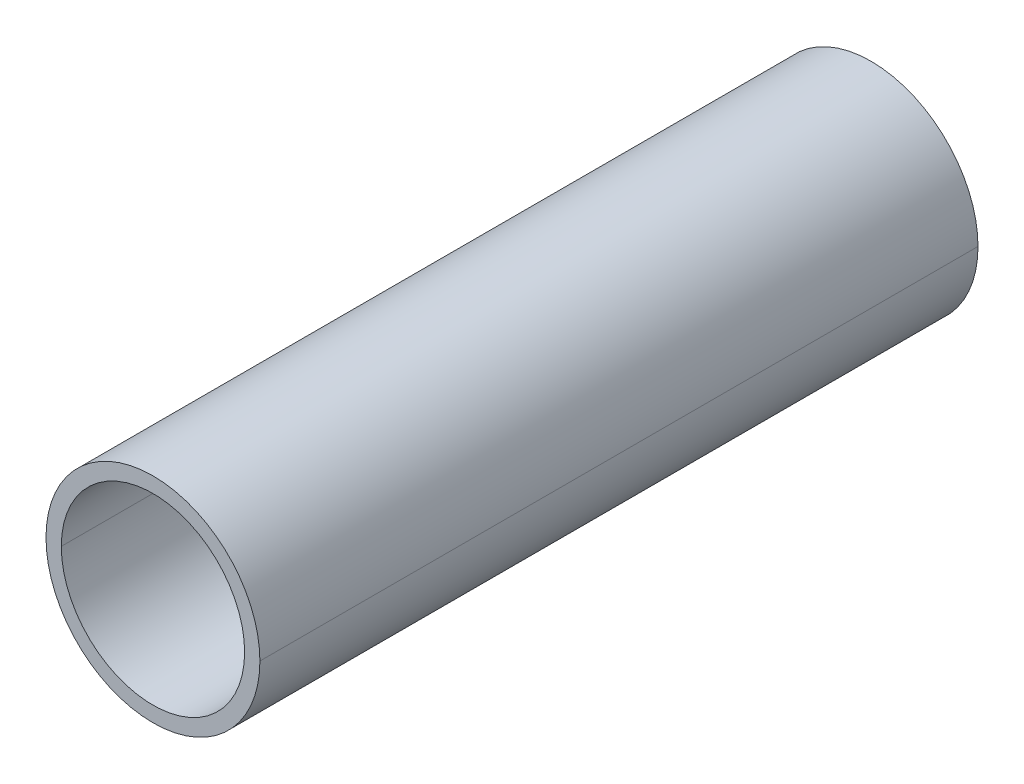
ISO-10303-21;
HEADER;
FILE_DESCRIPTION(('STEP AP214'),'2;1');
FILE_NAME('part.step','',(''),(''),'','','');
FILE_SCHEMA(('AUTOMOTIVE_DESIGN { 1 0 10303 214 1 1 1 1 }'));
ENDSEC;
DATA;
#1=APPLICATION_CONTEXT('core data for automotive mechanical design processes');
#2=APPLICATION_PROTOCOL_DEFINITION('international standard','automotive_design',2000,#1);
#3=PRODUCT_CONTEXT('',#1,'mechanical');
#4=PRODUCT('Part','Part','',(#3));
#5=PRODUCT_RELATED_PRODUCT_CATEGORY('part','',(#4));
#6=PRODUCT_DEFINITION_FORMATION('','',#4);
#7=PRODUCT_DEFINITION_CONTEXT('part definition',#1,'design');
#8=PRODUCT_DEFINITION('design','',#6,#7);
#9=PRODUCT_DEFINITION_SHAPE('','',#8);
#10=(LENGTH_UNIT() NAMED_UNIT(*) SI_UNIT(.MILLI.,.METRE.));
#11=(NAMED_UNIT(*) PLANE_ANGLE_UNIT() SI_UNIT($,.RADIAN.));
#12=(NAMED_UNIT(*) SI_UNIT($,.STERADIAN.) SOLID_ANGLE_UNIT());
#13=UNCERTAINTY_MEASURE_WITH_UNIT(LENGTH_MEASURE(1.E-05),#10,'distance_accuracy_value','');
#14=(GEOMETRIC_REPRESENTATION_CONTEXT(3) GLOBAL_UNCERTAINTY_ASSIGNED_CONTEXT((#13)) GLOBAL_UNIT_ASSIGNED_CONTEXT((#10,
#11,#12)) REPRESENTATION_CONTEXT('',''));
#15=CARTESIAN_POINT('',(0.,0.,0.));
#16=DIRECTION('',(0.,0.,1.));
#17=DIRECTION('',(1.,0.,0.));
#18=AXIS2_PLACEMENT_3D('',#15,#16,#17);
#19=CARTESIAN_POINT('',(0.,0.,149.225));
#20=DIRECTION('',(0.,0.,-1.));
#21=DIRECTION('',(-1.,0.,0.));
#22=AXIS2_PLACEMENT_3D('',#19,#20,#21);
#23=CYLINDRICAL_SURFACE('',#22,38.1);
#24=DIRECTION('',(0.,0.,-1.));
#25=VECTOR('',#24,1.);
#26=CARTESIAN_POINT('',(38.1,0.,149.225));
#27=LINE('',#26,#25);
#28=CARTESIAN_POINT('',(38.1,0.,149.225));
#29=VERTEX_POINT('',#28);
#30=CARTESIAN_POINT('',(38.1,0.,-149.225));
#31=VERTEX_POINT('',#30);
#32=EDGE_CURVE('E66',#29,#31,#27,.T.);
#33=ORIENTED_EDGE('',*,*,#32,.F.);
#34=CARTESIAN_POINT('',(0.,0.,149.225));
#35=DIRECTION('',(0.,0.,1.));
#36=DIRECTION('',(1.,0.,0.));
#37=AXIS2_PLACEMENT_3D('',#34,#35,#36);
#38=CIRCLE('',#37,38.1);
#39=CARTESIAN_POINT('',(-38.1,0.,149.225));
#40=VERTEX_POINT('',#39);
#41=EDGE_CURVE('E59',#29,#40,#38,.T.);
#42=ORIENTED_EDGE('',*,*,#41,.T.);
#43=DIRECTION('',(0.,0.,-1.));
#44=VECTOR('',#43,1.);
#45=CARTESIAN_POINT('',(-38.1,0.,149.225));
#46=LINE('',#45,#44);
#47=CARTESIAN_POINT('',(-38.1,0.,-149.225));
#48=VERTEX_POINT('',#47);
#49=EDGE_CURVE('E63',#40,#48,#46,.T.);
#50=ORIENTED_EDGE('',*,*,#49,.T.);
#51=CARTESIAN_POINT('',(0.,0.,-149.225));
#52=DIRECTION('',(0.,0.,1.));
#53=DIRECTION('',(1.,0.,0.));
#54=AXIS2_PLACEMENT_3D('',#51,#52,#53);
#55=CIRCLE('',#54,38.1);
#56=EDGE_CURVE('E10',#31,#48,#55,.T.);
#57=ORIENTED_EDGE('',*,*,#56,.F.);
#58=EDGE_LOOP('',(#33,#42,#50,#57));
#59=FACE_BOUND('',#58,.T.);
#60=ADVANCED_FACE('F16',(#59),#23,.F.);
#61=CARTESIAN_POINT('',(0.,0.,149.225));
#62=DIRECTION('',(0.,0.,-1.));
#63=DIRECTION('',(-1.,0.,0.));
#64=AXIS2_PLACEMENT_3D('',#61,#62,#63);
#65=CYLINDRICAL_SURFACE('',#64,44.45);
#66=DIRECTION('',(0.,0.,-1.));
#67=VECTOR('',#66,1.);
#68=CARTESIAN_POINT('',(44.45,0.,149.225));
#69=LINE('',#68,#67);
#70=CARTESIAN_POINT('',(44.45,0.,149.225));
#71=VERTEX_POINT('',#70);
#72=CARTESIAN_POINT('',(44.45,0.,-149.225));
#73=VERTEX_POINT('',#72);
#74=EDGE_CURVE('E101',#71,#73,#69,.T.);
#75=ORIENTED_EDGE('',*,*,#74,.F.);
#76=CARTESIAN_POINT('',(0.,0.,149.225));
#77=DIRECTION('',(0.,0.,1.));
#78=DIRECTION('',(1.,0.,0.));
#79=AXIS2_PLACEMENT_3D('',#76,#77,#78);
#80=CIRCLE('',#79,44.45);
#81=CARTESIAN_POINT('',(-44.45,0.,149.225));
#82=VERTEX_POINT('',#81);
#83=EDGE_CURVE('E71',#82,#71,#80,.T.);
#84=ORIENTED_EDGE('',*,*,#83,.F.);
#85=DIRECTION('',(0.,0.,-1.));
#86=VECTOR('',#85,1.);
#87=CARTESIAN_POINT('',(-44.45,0.,149.225));
#88=LINE('',#87,#86);
#89=CARTESIAN_POINT('',(-44.45,0.,-149.225));
#90=VERTEX_POINT('',#89);
#91=EDGE_CURVE('E94',#82,#90,#88,.T.);
#92=ORIENTED_EDGE('',*,*,#91,.T.);
#93=CARTESIAN_POINT('',(0.,0.,-149.225));
#94=DIRECTION('',(0.,0.,1.));
#95=DIRECTION('',(1.,0.,0.));
#96=AXIS2_PLACEMENT_3D('',#93,#94,#95);
#97=CIRCLE('',#96,44.45);
#98=EDGE_CURVE('E27',#90,#73,#97,.T.);
#99=ORIENTED_EDGE('',*,*,#98,.T.);
#100=EDGE_LOOP('',(#75,#84,#92,#99));
#101=FACE_BOUND('',#100,.T.);
#102=ADVANCED_FACE('F18',(#101),#65,.T.);
#103=CARTESIAN_POINT('',(0.,0.,-149.225));
#104=DIRECTION('',(0.,0.,1.));
#105=DIRECTION('',(1.,0.,0.));
#106=AXIS2_PLACEMENT_3D('',#103,#104,#105);
#107=PLANE('',#106);
#108=CARTESIAN_POINT('',(0.,0.,-149.225));
#109=DIRECTION('',(0.,0.,1.));
#110=DIRECTION('',(1.,0.,0.));
#111=AXIS2_PLACEMENT_3D('',#108,#109,#110);
#112=CIRCLE('',#111,38.1);
#113=EDGE_CURVE('E76',#48,#31,#112,.T.);
#114=ORIENTED_EDGE('',*,*,#113,.T.);
#115=ORIENTED_EDGE('',*,*,#56,.T.);
#116=EDGE_LOOP('',(#114,#115));
#117=FACE_BOUND('',#116,.T.);
#118=ORIENTED_EDGE('',*,*,#98,.F.);
#119=CARTESIAN_POINT('',(0.,0.,-149.225));
#120=DIRECTION('',(0.,0.,1.));
#121=DIRECTION('',(1.,0.,0.));
#122=AXIS2_PLACEMENT_3D('',#119,#120,#121);
#123=CIRCLE('',#122,44.45);
#124=EDGE_CURVE('E97',#73,#90,#123,.T.);
#125=ORIENTED_EDGE('',*,*,#124,.F.);
#126=EDGE_LOOP('',(#118,#125));
#127=FACE_BOUND('',#126,.T.);
#128=ADVANCED_FACE('F131',(#117,#127),#107,.F.);
#129=CARTESIAN_POINT('',(0.,0.,149.225));
#130=DIRECTION('',(0.,0.,1.));
#131=DIRECTION('',(1.,0.,0.));
#132=AXIS2_PLACEMENT_3D('',#129,#130,#131);
#133=PLANE('',#132);
#134=CARTESIAN_POINT('',(0.,0.,149.225));
#135=DIRECTION('',(0.,0.,1.));
#136=DIRECTION('',(1.,0.,0.));
#137=AXIS2_PLACEMENT_3D('',#134,#135,#136);
#138=CIRCLE('',#137,38.1);
#139=EDGE_CURVE('E20',#40,#29,#138,.T.);
#140=ORIENTED_EDGE('',*,*,#139,.F.);
#141=ORIENTED_EDGE('',*,*,#41,.F.);
#142=EDGE_LOOP('',(#140,#141));
#143=FACE_BOUND('',#142,.T.);
#144=ORIENTED_EDGE('',*,*,#83,.T.);
#145=CARTESIAN_POINT('',(0.,0.,149.225));
#146=DIRECTION('',(0.,0.,1.));
#147=DIRECTION('',(1.,0.,0.));
#148=AXIS2_PLACEMENT_3D('',#145,#146,#147);
#149=CIRCLE('',#148,44.45);
#150=EDGE_CURVE('E78',#71,#82,#149,.T.);
#151=ORIENTED_EDGE('',*,*,#150,.T.);
#152=EDGE_LOOP('',(#144,#151));
#153=FACE_BOUND('',#152,.T.);
#154=ADVANCED_FACE('F80',(#143,#153),#133,.T.);
#155=CARTESIAN_POINT('',(0.,0.,149.225));
#156=DIRECTION('',(0.,0.,-1.));
#157=DIRECTION('',(-1.,0.,0.));
#158=AXIS2_PLACEMENT_3D('',#155,#156,#157);
#159=CYLINDRICAL_SURFACE('',#158,44.45);
#160=ORIENTED_EDGE('',*,*,#150,.F.);
#161=ORIENTED_EDGE('',*,*,#74,.T.);
#162=ORIENTED_EDGE('',*,*,#124,.T.);
#163=ORIENTED_EDGE('',*,*,#91,.F.);
#164=EDGE_LOOP('',(#160,#161,#162,#163));
#165=FACE_BOUND('',#164,.T.);
#166=ADVANCED_FACE('F118',(#165),#159,.T.);
#167=CARTESIAN_POINT('',(0.,0.,149.225));
#168=DIRECTION('',(0.,0.,-1.));
#169=DIRECTION('',(-1.,0.,0.));
#170=AXIS2_PLACEMENT_3D('',#167,#168,#169);
#171=CYLINDRICAL_SURFACE('',#170,38.1);
#172=ORIENTED_EDGE('',*,*,#139,.T.);
#173=ORIENTED_EDGE('',*,*,#32,.T.);
#174=ORIENTED_EDGE('',*,*,#113,.F.);
#175=ORIENTED_EDGE('',*,*,#49,.F.);
#176=EDGE_LOOP('',(#172,#173,#174,#175));
#177=FACE_BOUND('',#176,.T.);
#178=ADVANCED_FACE('F74',(#177),#171,.F.);
#179=CLOSED_SHELL('',(#60,#102,#128,#154,#166,#178));
#180=MANIFOLD_SOLID_BREP('B1',#179);
#181=ADVANCED_BREP_SHAPE_REPRESENTATION('',(#18,#180),#14);
#182=SHAPE_DEFINITION_REPRESENTATION(#9,#181);
ENDSEC;
END-ISO-10303-21;
